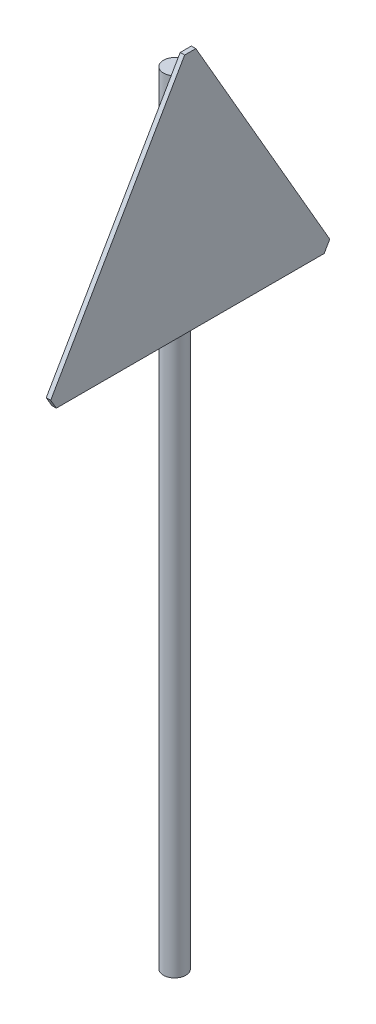
ISO-10303-21;
HEADER;
FILE_DESCRIPTION(('STEP AP214'),'2;1');
FILE_NAME('part.step','',(''),(''),'','','');
FILE_SCHEMA(('AUTOMOTIVE_DESIGN { 1 0 10303 214 1 1 1 1 }'));
ENDSEC;
DATA;
#1=APPLICATION_CONTEXT('core data for automotive mechanical design processes');
#2=APPLICATION_PROTOCOL_DEFINITION('international standard','automotive_design',2000,#1);
#3=PRODUCT_CONTEXT('',#1,'mechanical');
#4=PRODUCT('Part','Part','',(#3));
#5=PRODUCT_RELATED_PRODUCT_CATEGORY('part','',(#4));
#6=PRODUCT_DEFINITION_FORMATION('','',#4);
#7=PRODUCT_DEFINITION_CONTEXT('part definition',#1,'design');
#8=PRODUCT_DEFINITION('design','',#6,#7);
#9=PRODUCT_DEFINITION_SHAPE('','',#8);
#10=(LENGTH_UNIT() NAMED_UNIT(*) SI_UNIT(.MILLI.,.METRE.));
#11=(NAMED_UNIT(*) PLANE_ANGLE_UNIT() SI_UNIT($,.RADIAN.));
#12=(NAMED_UNIT(*) SI_UNIT($,.STERADIAN.) SOLID_ANGLE_UNIT());
#13=UNCERTAINTY_MEASURE_WITH_UNIT(LENGTH_MEASURE(1.E-05),#10,'distance_accuracy_value','');
#14=(GEOMETRIC_REPRESENTATION_CONTEXT(3) GLOBAL_UNCERTAINTY_ASSIGNED_CONTEXT((#13)) GLOBAL_UNIT_ASSIGNED_CONTEXT((#10,
#11,#12)) REPRESENTATION_CONTEXT('',''));
#15=CARTESIAN_POINT('',(0.,0.,0.));
#16=DIRECTION('',(0.,0.,1.));
#17=DIRECTION('',(1.,0.,0.));
#18=AXIS2_PLACEMENT_3D('',#15,#16,#17);
#19=CARTESIAN_POINT('',(0.7,9.08959567622613,-15.7436415314819));
#20=DIRECTION('',(0.,-0.500000000000004,0.866025403784436));
#21=DIRECTION('',(0.,-0.866025403784436,-0.500000000000005));
#22=AXIS2_PLACEMENT_3D('',#19,#20,#21);
#23=PLANE('',#22);
#24=DIRECTION('',(0.,0.866025403784436,0.500000000000005));
#25=VECTOR('',#24,1.);
#26=CARTESIAN_POINT('',(0.5,9.08959567622613,-15.7436415314819));
#27=LINE('',#26,#25);
#28=CARTESIAN_POINT('',(0.5,25.5330651575985,-6.25));
#29=VERTEX_POINT('',#28);
#30=CARTESIAN_POINT('',(0.5,35.9253700030116,-0.250000000000009));
#31=VERTEX_POINT('',#30);
#32=EDGE_CURVE('E112',#29,#31,#27,.T.);
#33=ORIENTED_EDGE('',*,*,#32,.T.);
#34=DIRECTION('',(1.,0.,0.));
#35=VECTOR('',#34,1.);
#36=CARTESIAN_POINT('',(0.7,35.9253700030116,-0.250000000000011));
#37=LINE('',#36,#35);
#38=CARTESIAN_POINT('',(0.7,35.9253700030116,-0.250000000000009));
#39=VERTEX_POINT('',#38);
#40=EDGE_CURVE('E56',#31,#39,#37,.T.);
#41=ORIENTED_EDGE('',*,*,#40,.T.);
#42=DIRECTION('',(0.,0.866025403784436,0.500000000000005));
#43=VECTOR('',#42,1.);
#44=CARTESIAN_POINT('',(0.7,9.08959567622613,-15.7436415314819));
#45=LINE('',#44,#43);
#46=CARTESIAN_POINT('',(0.7,25.5330651575985,-6.25));
#47=VERTEX_POINT('',#46);
#48=EDGE_CURVE('E113',#47,#39,#45,.T.);
#49=ORIENTED_EDGE('',*,*,#48,.F.);
#50=DIRECTION('',(-1.,0.,0.));
#51=VECTOR('',#50,1.);
#52=CARTESIAN_POINT('',(0.7,25.5330651575985,-6.25));
#53=LINE('',#52,#51);
#54=EDGE_CURVE('E105',#47,#29,#53,.T.);
#55=ORIENTED_EDGE('',*,*,#54,.T.);
#56=EDGE_LOOP('',(#33,#41,#49,#55));
#57=FACE_BOUND('',#56,.T.);
#58=ADVANCED_FACE('F47',(#57),#23,.F.);
#59=CARTESIAN_POINT('',(0.7,9.08959567622611,15.7436415314818));
#60=DIRECTION('',(0.,-0.500000000000004,-0.866025403784436));
#61=DIRECTION('',(0.,0.866025403784436,-0.500000000000004));
#62=AXIS2_PLACEMENT_3D('',#59,#60,#61);
#63=PLANE('',#62);
#64=DIRECTION('',(0.,-0.866025403784436,0.500000000000004));
#65=VECTOR('',#64,1.);
#66=CARTESIAN_POINT('',(0.7,9.08959567622611,15.7436415314818));
#67=LINE('',#66,#65);
#68=CARTESIAN_POINT('',(0.7,35.9253700030117,0.25));
#69=VERTEX_POINT('',#68);
#70=CARTESIAN_POINT('',(0.7,25.5330651575985,6.25));
#71=VERTEX_POINT('',#70);
#72=EDGE_CURVE('E144',#69,#71,#67,.T.);
#73=ORIENTED_EDGE('',*,*,#72,.F.);
#74=DIRECTION('',(-1.,0.,0.));
#75=VECTOR('',#74,1.);
#76=CARTESIAN_POINT('',(0.7,35.9253700030116,0.250000000000002));
#77=LINE('',#76,#75);
#78=CARTESIAN_POINT('',(0.5,35.9253700030117,0.25));
#79=VERTEX_POINT('',#78);
#80=EDGE_CURVE('E137',#69,#79,#77,.T.);
#81=ORIENTED_EDGE('',*,*,#80,.T.);
#82=DIRECTION('',(0.,-0.866025403784436,0.500000000000004));
#83=VECTOR('',#82,1.);
#84=CARTESIAN_POINT('',(0.5,9.08959567622611,15.7436415314818));
#85=LINE('',#84,#83);
#86=CARTESIAN_POINT('',(0.5,25.5330651575985,6.25));
#87=VERTEX_POINT('',#86);
#88=EDGE_CURVE('E117',#79,#87,#85,.T.);
#89=ORIENTED_EDGE('',*,*,#88,.T.);
#90=DIRECTION('',(1.,0.,0.));
#91=VECTOR('',#90,1.);
#92=CARTESIAN_POINT('',(0.7,25.5330651575985,6.25));
#93=LINE('',#92,#91);
#94=EDGE_CURVE('E134',#87,#71,#93,.T.);
#95=ORIENTED_EDGE('',*,*,#94,.T.);
#96=EDGE_LOOP('',(#73,#81,#89,#95));
#97=FACE_BOUND('',#96,.T.);
#98=ADVANCED_FACE('F143',(#97),#63,.F.);
#99=CARTESIAN_POINT('',(0.7,25.1000524557063,0.));
#100=DIRECTION('',(0.,1.,0.));
#101=DIRECTION('',(0.,0.,1.));
#102=AXIS2_PLACEMENT_3D('',#99,#100,#101);
#103=PLANE('',#102);
#104=DIRECTION('',(0.,0.,-1.));
#105=VECTOR('',#104,1.);
#106=CARTESIAN_POINT('',(0.5,25.1000524557063,0.));
#107=LINE('',#106,#105);
#108=CARTESIAN_POINT('',(0.5,25.1000524557063,6.));
#109=VERTEX_POINT('',#108);
#110=CARTESIAN_POINT('',(0.5,25.1000524557063,-6.00000000000001));
#111=VERTEX_POINT('',#110);
#112=EDGE_CURVE('E119',#109,#111,#107,.T.);
#113=ORIENTED_EDGE('',*,*,#112,.T.);
#114=DIRECTION('',(1.,0.,0.));
#115=VECTOR('',#114,1.);
#116=CARTESIAN_POINT('',(0.7,25.1000524557063,-6.00000000000001));
#117=LINE('',#116,#115);
#118=CARTESIAN_POINT('',(0.7,25.1000524557063,-6.00000000000001));
#119=VERTEX_POINT('',#118);
#120=EDGE_CURVE('E106',#111,#119,#117,.T.);
#121=ORIENTED_EDGE('',*,*,#120,.T.);
#122=DIRECTION('',(0.,0.,-1.));
#123=VECTOR('',#122,1.);
#124=CARTESIAN_POINT('',(0.7,25.1000524557063,0.));
#125=LINE('',#124,#123);
#126=CARTESIAN_POINT('',(0.7,25.1000524557063,6.));
#127=VERTEX_POINT('',#126);
#128=EDGE_CURVE('E114',#127,#119,#125,.T.);
#129=ORIENTED_EDGE('',*,*,#128,.F.);
#130=DIRECTION('',(-1.,0.,0.));
#131=VECTOR('',#130,1.);
#132=CARTESIAN_POINT('',(0.7,25.1000524557063,6.));
#133=LINE('',#132,#131);
#134=EDGE_CURVE('E109',#127,#109,#133,.T.);
#135=ORIENTED_EDGE('',*,*,#134,.T.);
#136=EDGE_LOOP('',(#113,#121,#129,#135));
#137=FACE_BOUND('',#136,.T.);
#138=ADVANCED_FACE('F157',(#137),#103,.F.);
#139=CARTESIAN_POINT('',(0.7,0.,0.));
#140=DIRECTION('',(1.,0.,0.));
#141=DIRECTION('',(0.,0.,-1.));
#142=AXIS2_PLACEMENT_3D('',#139,#140,#141);
#143=PLANE('',#142);
#144=ORIENTED_EDGE('',*,*,#48,.T.);
#145=DIRECTION('',(0.,0.,-1.));
#146=VECTOR('',#145,1.);
#147=CARTESIAN_POINT('',(0.7,35.9253700030116,-4.98564661819007E-13));
#148=LINE('',#147,#146);
#149=EDGE_CURVE('E12',#39,#69,#148,.F.);
#150=ORIENTED_EDGE('',*,*,#149,.T.);
#151=ORIENTED_EDGE('',*,*,#72,.T.);
#152=DIRECTION('',(0.,0.866025403784445,0.499999999999989));
#153=VECTOR('',#152,1.);
#154=CARTESIAN_POINT('',(0.7,3.67693690257301,-6.36864153148159));
#155=LINE('',#154,#153);
#156=EDGE_CURVE('E130',#71,#127,#155,.F.);
#157=ORIENTED_EDGE('',*,*,#156,.T.);
#158=ORIENTED_EDGE('',*,*,#128,.T.);
#159=DIRECTION('',(0.,-0.866025403784446,0.499999999999987));
#160=VECTOR('',#159,1.);
#161=CARTESIAN_POINT('',(0.7,3.67693690257298,6.36864153148155));
#162=LINE('',#161,#160);
#163=EDGE_CURVE('E132',#119,#47,#162,.F.);
#164=ORIENTED_EDGE('',*,*,#163,.T.);
#165=EDGE_LOOP('',(#144,#150,#151,#157,#158,#164));
#166=FACE_BOUND('',#165,.T.);
#167=ADVANCED_FACE('F155',(#166),#143,.T.);
#168=CARTESIAN_POINT('',(0.5,0.,0.));
#169=DIRECTION('',(1.,0.,0.));
#170=DIRECTION('',(0.,0.,-1.));
#171=AXIS2_PLACEMENT_3D('',#168,#169,#170);
#172=PLANE('',#171);
#173=ORIENTED_EDGE('',*,*,#88,.F.);
#174=DIRECTION('',(0.,0.,1.));
#175=VECTOR('',#174,1.);
#176=CARTESIAN_POINT('',(0.5,35.9253700030116,0.249999999999999));
#177=LINE('',#176,#175);
#178=EDGE_CURVE('E70',#79,#31,#177,.F.);
#179=ORIENTED_EDGE('',*,*,#178,.T.);
#180=ORIENTED_EDGE('',*,*,#32,.F.);
#181=DIRECTION('',(0.,0.866025403784446,-0.499999999999987));
#182=VECTOR('',#181,1.);
#183=CARTESIAN_POINT('',(0.5,25.5330651575985,-6.25));
#184=LINE('',#183,#182);
#185=EDGE_CURVE('E101',#29,#111,#184,.F.);
#186=ORIENTED_EDGE('',*,*,#185,.T.);
#187=ORIENTED_EDGE('',*,*,#112,.F.);
#188=DIRECTION('',(0.,-0.866025403784445,-0.499999999999989));
#189=VECTOR('',#188,1.);
#190=CARTESIAN_POINT('',(0.5,25.1000524557063,6.00000000000001));
#191=LINE('',#190,#189);
#192=EDGE_CURVE('E110',#109,#87,#191,.F.);
#193=ORIENTED_EDGE('',*,*,#192,.T.);
#194=EDGE_LOOP('',(#173,#179,#180,#186,#187,#193));
#195=FACE_BOUND('',#194,.T.);
#196=ADVANCED_FACE('F116',(#195),#172,.F.);
#197=CARTESIAN_POINT('',(0.7,25.5330651575985,-6.25));
#198=DIRECTION('',(0.,0.499999999999987,0.866025403784446));
#199=DIRECTION('',(-1.,0.,0.));
#200=AXIS2_PLACEMENT_3D('',#197,#198,#199);
#201=PLANE('',#200);
#202=ORIENTED_EDGE('',*,*,#163,.F.);
#203=ORIENTED_EDGE('',*,*,#120,.F.);
#204=ORIENTED_EDGE('',*,*,#185,.F.);
#205=ORIENTED_EDGE('',*,*,#54,.F.);
#206=EDGE_LOOP('',(#202,#203,#204,#205));
#207=FACE_BOUND('',#206,.T.);
#208=ADVANCED_FACE('F104',(#207),#201,.F.);
#209=CARTESIAN_POINT('',(0.7,25.1000524557063,6.00000000000001));
#210=DIRECTION('',(0.,0.499999999999989,-0.866025403784445));
#211=DIRECTION('',(-1.,0.,0.));
#212=AXIS2_PLACEMENT_3D('',#209,#210,#211);
#213=PLANE('',#212);
#214=ORIENTED_EDGE('',*,*,#156,.F.);
#215=ORIENTED_EDGE('',*,*,#94,.F.);
#216=ORIENTED_EDGE('',*,*,#192,.F.);
#217=ORIENTED_EDGE('',*,*,#134,.F.);
#218=EDGE_LOOP('',(#214,#215,#216,#217));
#219=FACE_BOUND('',#218,.T.);
#220=ADVANCED_FACE('F151',(#219),#213,.F.);
#221=CARTESIAN_POINT('',(0.7,35.9253700030116,0.249999999999999));
#222=DIRECTION('',(0.,-1.,0.));
#223=DIRECTION('',(-1.,0.,0.));
#224=AXIS2_PLACEMENT_3D('',#221,#222,#223);
#225=PLANE('',#224);
#226=ORIENTED_EDGE('',*,*,#149,.F.);
#227=ORIENTED_EDGE('',*,*,#40,.F.);
#228=ORIENTED_EDGE('',*,*,#178,.F.);
#229=ORIENTED_EDGE('',*,*,#80,.F.);
#230=EDGE_LOOP('',(#226,#227,#228,#229));
#231=FACE_BOUND('',#230,.T.);
#232=ADVANCED_FACE('F50',(#231),#225,.F.);
#233=CLOSED_SHELL('',(#58,#98,#138,#167,#196,#208,#220,#232));
#234=MANIFOLD_SOLID_BREP('B2',#233);
#235=CARTESIAN_POINT('',(0.,35.,0.));
#236=DIRECTION('',(0.,-1.,0.));
#237=DIRECTION('',(0.,0.,-1.));
#238=AXIS2_PLACEMENT_3D('',#235,#236,#237);
#239=CYLINDRICAL_SURFACE('',#238,0.5);
#240=CARTESIAN_POINT('',(0.,35.,0.));
#241=DIRECTION('',(0.,1.,0.));
#242=DIRECTION('',(0.,0.,1.));
#243=AXIS2_PLACEMENT_3D('',#240,#241,#242);
#244=CIRCLE('',#243,0.5);
#245=CARTESIAN_POINT('',(0.,35.,0.5));
#246=VERTEX_POINT('',#245);
#247=EDGE_CURVE('E46',#246,#246,#244,.T.);
#248=ORIENTED_EDGE('',*,*,#247,.F.);
#249=EDGE_LOOP('',(#248));
#250=FACE_BOUND('',#249,.T.);
#251=CARTESIAN_POINT('',(0.,0.,0.));
#252=DIRECTION('',(0.,1.,0.));
#253=DIRECTION('',(0.,0.,1.));
#254=AXIS2_PLACEMENT_3D('',#251,#252,#253);
#255=CIRCLE('',#254,0.5);
#256=CARTESIAN_POINT('',(0.,0.,0.5));
#257=VERTEX_POINT('',#256);
#258=EDGE_CURVE('E235',#257,#257,#255,.T.);
#259=ORIENTED_EDGE('',*,*,#258,.T.);
#260=EDGE_LOOP('',(#259));
#261=FACE_BOUND('',#260,.T.);
#262=ADVANCED_FACE('F232',(#250,#261),#239,.T.);
#263=CARTESIAN_POINT('',(0.,35.,0.));
#264=DIRECTION('',(0.,1.,0.));
#265=DIRECTION('',(0.,0.,1.));
#266=AXIS2_PLACEMENT_3D('',#263,#264,#265);
#267=PLANE('',#266);
#268=ORIENTED_EDGE('',*,*,#247,.T.);
#269=EDGE_LOOP('',(#268));
#270=FACE_BOUND('',#269,.T.);
#271=ADVANCED_FACE('F247',(#270),#267,.T.);
#272=CARTESIAN_POINT('',(0.,0.,0.));
#273=DIRECTION('',(0.,1.,0.));
#274=DIRECTION('',(0.,0.,1.));
#275=AXIS2_PLACEMENT_3D('',#272,#273,#274);
#276=PLANE('',#275);
#277=ORIENTED_EDGE('',*,*,#258,.F.);
#278=EDGE_LOOP('',(#277));
#279=FACE_BOUND('',#278,.T.);
#280=ADVANCED_FACE('F245',(#279),#276,.F.);
#281=CLOSED_SHELL('',(#262,#271,#280));
#282=MANIFOLD_SOLID_BREP('B6',#281);
#283=ADVANCED_BREP_SHAPE_REPRESENTATION('',(#18,#234,#282),#14);
#284=SHAPE_DEFINITION_REPRESENTATION(#9,#283);
ENDSEC;
END-ISO-10303-21;
